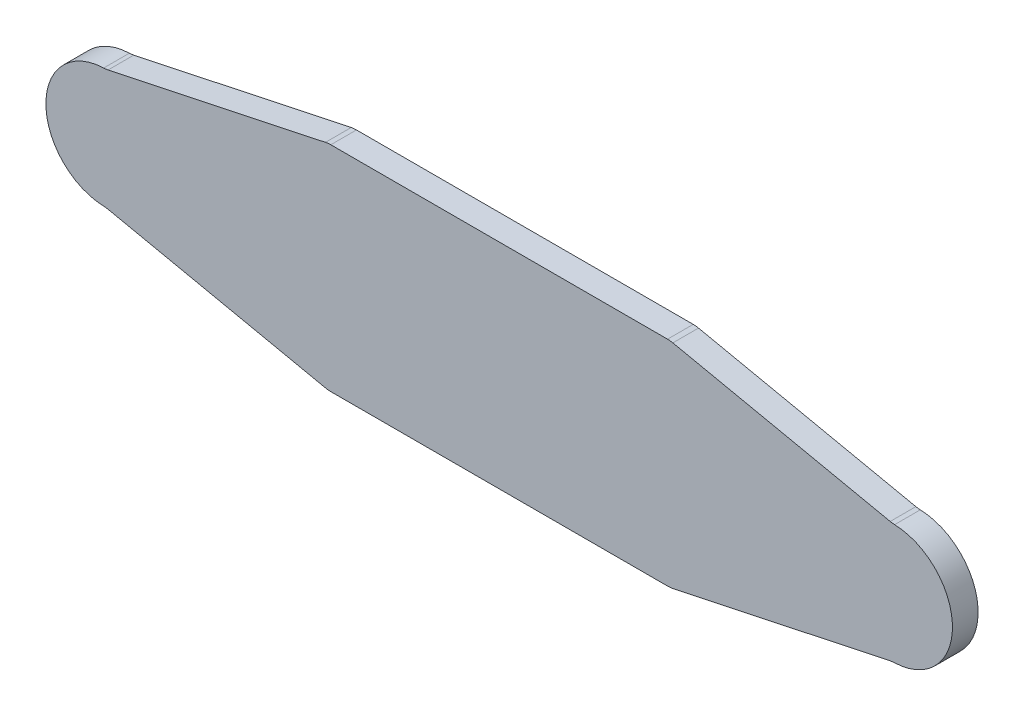
ISO-10303-21;
HEADER;
FILE_DESCRIPTION(('STEP AP214'),'2;1');
FILE_NAME('part.step','',(''),(''),'','','');
FILE_SCHEMA(('AUTOMOTIVE_DESIGN { 1 0 10303 214 1 1 1 1 }'));
ENDSEC;
DATA;
#1=APPLICATION_CONTEXT('core data for automotive mechanical design processes');
#2=APPLICATION_PROTOCOL_DEFINITION('international standard','automotive_design',2000,#1);
#3=PRODUCT_CONTEXT('',#1,'mechanical');
#4=PRODUCT('Part','Part','',(#3));
#5=PRODUCT_RELATED_PRODUCT_CATEGORY('part','',(#4));
#6=PRODUCT_DEFINITION_FORMATION('','',#4);
#7=PRODUCT_DEFINITION_CONTEXT('part definition',#1,'design');
#8=PRODUCT_DEFINITION('design','',#6,#7);
#9=PRODUCT_DEFINITION_SHAPE('','',#8);
#10=(LENGTH_UNIT() NAMED_UNIT(*) SI_UNIT(.MILLI.,.METRE.));
#11=(NAMED_UNIT(*) PLANE_ANGLE_UNIT() SI_UNIT($,.RADIAN.));
#12=(NAMED_UNIT(*) SI_UNIT($,.STERADIAN.) SOLID_ANGLE_UNIT());
#13=UNCERTAINTY_MEASURE_WITH_UNIT(LENGTH_MEASURE(1.E-05),#10,'distance_accuracy_value','');
#14=(GEOMETRIC_REPRESENTATION_CONTEXT(3) GLOBAL_UNCERTAINTY_ASSIGNED_CONTEXT((#13)) GLOBAL_UNIT_ASSIGNED_CONTEXT((#10,
#11,#12)) REPRESENTATION_CONTEXT('',''));
#15=CARTESIAN_POINT('',(0.,0.,0.));
#16=DIRECTION('',(0.,0.,1.));
#17=DIRECTION('',(1.,0.,0.));
#18=AXIS2_PLACEMENT_3D('',#15,#16,#17);
#19=CARTESIAN_POINT('',(0.,0.,3.));
#20=DIRECTION('',(0.206958591044392,-0.978349703118941,0.));
#21=DIRECTION('',(0.978349703118941,0.206958591044392,0.));
#22=AXIS2_PLACEMENT_3D('',#19,#20,#21);
#23=PLANE('',#22);
#24=DIRECTION('',(-0.978349703118941,-0.206958591044392,0.));
#25=VECTOR('',#24,1.);
#26=CARTESIAN_POINT('',(0.,0.,3.));
#27=LINE('',#26,#25);
#28=CARTESIAN_POINT('',(-0.307040573949562,-0.0649508906431766,3.));
#29=VERTEX_POINT('',#28);
#30=CARTESIAN_POINT('',(-25.7205151025413,-5.44087819476836,3.));
#31=VERTEX_POINT('',#30);
#32=EDGE_CURVE('E196',#29,#31,#27,.T.);
#33=ORIENTED_EDGE('',*,*,#32,.F.);
#34=DIRECTION('',(0.,0.,-1.));
#35=VECTOR('',#34,1.);
#36=CARTESIAN_POINT('',(-0.307040573949562,-0.0649508906431766,3.));
#37=LINE('',#36,#35);
#38=CARTESIAN_POINT('',(-0.307040573949562,-0.0649508906431766,0.));
#39=VERTEX_POINT('',#38);
#40=EDGE_CURVE('E160',#29,#39,#37,.T.);
#41=ORIENTED_EDGE('',*,*,#40,.T.);
#42=DIRECTION('',(-0.978349703118941,-0.206958591044392,0.));
#43=VECTOR('',#42,1.);
#44=CARTESIAN_POINT('',(0.,0.,0.));
#45=LINE('',#44,#43);
#46=CARTESIAN_POINT('',(-25.7205151025413,-5.44087819476836,0.));
#47=VERTEX_POINT('',#46);
#48=EDGE_CURVE('E182',#39,#47,#45,.T.);
#49=ORIENTED_EDGE('',*,*,#48,.T.);
#50=DIRECTION('',(0.,0.,1.));
#51=VECTOR('',#50,1.);
#52=CARTESIAN_POINT('',(-25.7205151025413,-5.44087819476836,3.));
#53=LINE('',#52,#51);
#54=EDGE_CURVE('E240',#47,#31,#53,.T.);
#55=ORIENTED_EDGE('',*,*,#54,.T.);
#56=EDGE_LOOP('',(#33,#41,#49,#55));
#57=FACE_BOUND('',#56,.T.);
#58=ADVANCED_FACE('F35',(#57),#23,.F.);
#59=CARTESIAN_POINT('',(-26.,-12.5,3.));
#60=DIRECTION('',(0.,0.,-1.));
#61=DIRECTION('',(-1.,0.,0.));
#62=AXIS2_PLACEMENT_3D('',#59,#60,#61);
#63=CYLINDRICAL_SURFACE('',#62,7.);
#64=CARTESIAN_POINT('',(-26.,-12.5,0.));
#65=DIRECTION('',(0.,0.,1.));
#66=DIRECTION('',(1.,0.,0.));
#67=AXIS2_PLACEMENT_3D('',#64,#65,#66);
#68=CIRCLE('',#67,7.);
#69=CARTESIAN_POINT('',(-26.2389736129721,-5.50408035978807,0.));
#70=VERTEX_POINT('',#69);
#71=CARTESIAN_POINT('',(-26.2389736129721,-19.4959196402119,0.));
#72=VERTEX_POINT('',#71);
#73=EDGE_CURVE('E177',#70,#72,#68,.T.);
#74=ORIENTED_EDGE('',*,*,#73,.T.);
#75=DIRECTION('',(0.,0.,-1.));
#76=VECTOR('',#75,1.);
#77=CARTESIAN_POINT('',(-26.2389736129721,-19.4959196402119,3.));
#78=LINE('',#77,#76);
#79=CARTESIAN_POINT('',(-26.2389736129721,-19.4959196402119,3.));
#80=VERTEX_POINT('',#79);
#81=EDGE_CURVE('E154',#72,#80,#78,.F.);
#82=ORIENTED_EDGE('',*,*,#81,.T.);
#83=CARTESIAN_POINT('',(-26.,-12.5,3.));
#84=DIRECTION('',(0.,0.,1.));
#85=DIRECTION('',(1.,0.,0.));
#86=AXIS2_PLACEMENT_3D('',#83,#84,#85);
#87=CIRCLE('',#86,7.);
#88=CARTESIAN_POINT('',(-26.2389736129721,-5.50408035978807,3.));
#89=VERTEX_POINT('',#88);
#90=EDGE_CURVE('E265',#89,#80,#87,.T.);
#91=ORIENTED_EDGE('',*,*,#90,.F.);
#92=DIRECTION('',(0.,0.,-1.));
#93=VECTOR('',#92,1.);
#94=CARTESIAN_POINT('',(-26.2389736129721,-5.50408035978807,3.));
#95=LINE('',#94,#93);
#96=EDGE_CURVE('E170',#89,#70,#95,.T.);
#97=ORIENTED_EDGE('',*,*,#96,.T.);
#98=EDGE_LOOP('',(#74,#82,#91,#97));
#99=FACE_BOUND('',#98,.T.);
#100=ADVANCED_FACE('F267',(#99),#63,.T.);
#101=CARTESIAN_POINT('',(0.,-25.,3.));
#102=DIRECTION('',(0.206958591044391,0.978349703118941,0.));
#103=DIRECTION('',(-0.978349703118941,0.206958591044391,0.));
#104=AXIS2_PLACEMENT_3D('',#101,#102,#103);
#105=PLANE('',#104);
#106=DIRECTION('',(0.978349703118941,-0.206958591044391,0.));
#107=VECTOR('',#106,1.);
#108=CARTESIAN_POINT('',(0.,-25.,3.));
#109=LINE('',#108,#107);
#110=CARTESIAN_POINT('',(-25.7205151025413,-19.5591218052317,3.));
#111=VERTEX_POINT('',#110);
#112=CARTESIAN_POINT('',(-0.307040573949554,-24.9350491093568,3.));
#113=VERTEX_POINT('',#112);
#114=EDGE_CURVE('E169',#111,#113,#109,.T.);
#115=ORIENTED_EDGE('',*,*,#114,.F.);
#116=DIRECTION('',(0.,0.,1.));
#117=VECTOR('',#116,1.);
#118=CARTESIAN_POINT('',(-25.7205151025413,-19.5591218052317,0.));
#119=LINE('',#118,#117);
#120=CARTESIAN_POINT('',(-25.7205151025413,-19.5591218052317,0.));
#121=VERTEX_POINT('',#120);
#122=EDGE_CURVE('E153',#111,#121,#119,.F.);
#123=ORIENTED_EDGE('',*,*,#122,.T.);
#124=DIRECTION('',(0.978349703118941,-0.206958591044391,0.));
#125=VECTOR('',#124,1.);
#126=CARTESIAN_POINT('',(0.,-25.,0.));
#127=LINE('',#126,#125);
#128=CARTESIAN_POINT('',(-0.307040573949554,-24.9350491093568,0.));
#129=VERTEX_POINT('',#128);
#130=EDGE_CURVE('E166',#121,#129,#127,.T.);
#131=ORIENTED_EDGE('',*,*,#130,.T.);
#132=DIRECTION('',(0.,0.,-1.));
#133=VECTOR('',#132,1.);
#134=CARTESIAN_POINT('',(-0.307040573949554,-24.9350491093568,3.));
#135=LINE('',#134,#133);
#136=EDGE_CURVE('E171',#129,#113,#135,.F.);
#137=ORIENTED_EDGE('',*,*,#136,.T.);
#138=EDGE_LOOP('',(#115,#123,#131,#137));
#139=FACE_BOUND('',#138,.T.);
#140=ADVANCED_FACE('F165',(#139),#105,.F.);
#141=CARTESIAN_POINT('',(0.,-25.,3.));
#142=DIRECTION('',(0.,1.,0.));
#143=DIRECTION('',(0.,0.,1.));
#144=AXIS2_PLACEMENT_3D('',#141,#142,#143);
#145=PLANE('',#144);
#146=DIRECTION('',(1.,0.,0.));
#147=VECTOR('',#146,1.);
#148=CARTESIAN_POINT('',(0.,-25.,3.));
#149=LINE('',#148,#147);
#150=CARTESIAN_POINT('',(0.31383519918362,-25.,3.));
#151=VERTEX_POINT('',#150);
#152=CARTESIAN_POINT('',(39.6861648008164,-25.,3.));
#153=VERTEX_POINT('',#152);
#154=EDGE_CURVE('E269',#151,#153,#149,.T.);
#155=ORIENTED_EDGE('',*,*,#154,.F.);
#156=DIRECTION('',(0.,0.,-1.));
#157=VECTOR('',#156,1.);
#158=CARTESIAN_POINT('',(0.31383519918362,-25.,3.));
#159=LINE('',#158,#157);
#160=CARTESIAN_POINT('',(0.31383519918362,-25.,0.));
#161=VERTEX_POINT('',#160);
#162=EDGE_CURVE('E204',#151,#161,#159,.T.);
#163=ORIENTED_EDGE('',*,*,#162,.T.);
#164=DIRECTION('',(1.,0.,0.));
#165=VECTOR('',#164,1.);
#166=CARTESIAN_POINT('',(0.,-25.,0.));
#167=LINE('',#166,#165);
#168=CARTESIAN_POINT('',(39.6861648008164,-25.,0.));
#169=VERTEX_POINT('',#168);
#170=EDGE_CURVE('E176',#161,#169,#167,.T.);
#171=ORIENTED_EDGE('',*,*,#170,.T.);
#172=DIRECTION('',(0.,0.,-1.));
#173=VECTOR('',#172,1.);
#174=CARTESIAN_POINT('',(39.6861648008164,-25.,3.));
#175=LINE('',#174,#173);
#176=EDGE_CURVE('E202',#169,#153,#175,.F.);
#177=ORIENTED_EDGE('',*,*,#176,.T.);
#178=EDGE_LOOP('',(#155,#163,#171,#177));
#179=FACE_BOUND('',#178,.T.);
#180=ADVANCED_FACE('F321',(#179),#145,.F.);
#181=CARTESIAN_POINT('',(40.,-25.,3.));
#182=DIRECTION('',(-0.206958591044391,0.978349703118941,0.));
#183=DIRECTION('',(-0.978349703118941,-0.206958591044391,0.));
#184=AXIS2_PLACEMENT_3D('',#181,#182,#183);
#185=PLANE('',#184);
#186=DIRECTION('',(0.978349703118941,0.206958591044391,0.));
#187=VECTOR('',#186,1.);
#188=CARTESIAN_POINT('',(40.,-25.,3.));
#189=LINE('',#188,#187);
#190=CARTESIAN_POINT('',(40.3070405739496,-24.9350491093568,3.));
#191=VERTEX_POINT('',#190);
#192=CARTESIAN_POINT('',(65.7205151025413,-19.5591218052317,3.));
#193=VERTEX_POINT('',#192);
#194=EDGE_CURVE('E275',#191,#193,#189,.T.);
#195=ORIENTED_EDGE('',*,*,#194,.F.);
#196=DIRECTION('',(0.,0.,-1.));
#197=VECTOR('',#196,1.);
#198=CARTESIAN_POINT('',(40.3070405739496,-24.9350491093568,3.));
#199=LINE('',#198,#197);
#200=CARTESIAN_POINT('',(40.3070405739496,-24.9350491093568,0.));
#201=VERTEX_POINT('',#200);
#202=EDGE_CURVE('E223',#191,#201,#199,.T.);
#203=ORIENTED_EDGE('',*,*,#202,.T.);
#204=DIRECTION('',(0.978349703118941,0.206958591044391,0.));
#205=VECTOR('',#204,1.);
#206=CARTESIAN_POINT('',(40.,-25.,0.));
#207=LINE('',#206,#205);
#208=CARTESIAN_POINT('',(65.7205151025413,-19.5591218052317,0.));
#209=VERTEX_POINT('',#208);
#210=EDGE_CURVE('E180',#201,#209,#207,.T.);
#211=ORIENTED_EDGE('',*,*,#210,.T.);
#212=DIRECTION('',(0.,0.,1.));
#213=VECTOR('',#212,1.);
#214=CARTESIAN_POINT('',(65.7205151025413,-19.5591218052317,3.));
#215=LINE('',#214,#213);
#216=EDGE_CURVE('E221',#209,#193,#215,.T.);
#217=ORIENTED_EDGE('',*,*,#216,.T.);
#218=EDGE_LOOP('',(#195,#203,#211,#217));
#219=FACE_BOUND('',#218,.T.);
#220=ADVANCED_FACE('F313',(#219),#185,.F.);
#221=CARTESIAN_POINT('',(66.,-12.5,3.));
#222=DIRECTION('',(0.,0.,-1.));
#223=DIRECTION('',(-1.,0.,0.));
#224=AXIS2_PLACEMENT_3D('',#221,#222,#223);
#225=CYLINDRICAL_SURFACE('',#224,7.);
#226=CARTESIAN_POINT('',(66.,-12.5,3.));
#227=DIRECTION('',(0.,0.,1.));
#228=DIRECTION('',(-1.,0.,0.));
#229=AXIS2_PLACEMENT_3D('',#226,#227,#228);
#230=CIRCLE('',#229,7.);
#231=CARTESIAN_POINT('',(66.2389736129721,-19.495919640212,3.));
#232=VERTEX_POINT('',#231);
#233=CARTESIAN_POINT('',(66.2389736129721,-5.50408035978809,3.));
#234=VERTEX_POINT('',#233);
#235=EDGE_CURVE('E278',#232,#234,#230,.T.);
#236=ORIENTED_EDGE('',*,*,#235,.F.);
#237=DIRECTION('',(0.,0.,-1.));
#238=VECTOR('',#237,1.);
#239=CARTESIAN_POINT('',(66.2389736129721,-19.495919640212,3.));
#240=LINE('',#239,#238);
#241=CARTESIAN_POINT('',(66.2389736129721,-19.495919640212,0.));
#242=VERTEX_POINT('',#241);
#243=EDGE_CURVE('E228',#232,#242,#240,.T.);
#244=ORIENTED_EDGE('',*,*,#243,.T.);
#245=CARTESIAN_POINT('',(66.,-12.5,0.));
#246=DIRECTION('',(0.,0.,1.));
#247=DIRECTION('',(-1.,0.,0.));
#248=AXIS2_PLACEMENT_3D('',#245,#246,#247);
#249=CIRCLE('',#248,7.);
#250=CARTESIAN_POINT('',(66.2389736129721,-5.50408035978809,0.));
#251=VERTEX_POINT('',#250);
#252=EDGE_CURVE('E188',#242,#251,#249,.T.);
#253=ORIENTED_EDGE('',*,*,#252,.T.);
#254=DIRECTION('',(0.,0.,-1.));
#255=VECTOR('',#254,1.);
#256=CARTESIAN_POINT('',(66.2389736129721,-5.50408035978808,3.));
#257=LINE('',#256,#255);
#258=EDGE_CURVE('E226',#251,#234,#257,.F.);
#259=ORIENTED_EDGE('',*,*,#258,.T.);
#260=EDGE_LOOP('',(#236,#244,#253,#259));
#261=FACE_BOUND('',#260,.T.);
#262=ADVANCED_FACE('F304',(#261),#225,.T.);
#263=CARTESIAN_POINT('',(40.,0.,3.));
#264=DIRECTION('',(-0.206958591044392,-0.978349703118941,0.));
#265=DIRECTION('',(0.978349703118941,-0.206958591044392,0.));
#266=AXIS2_PLACEMENT_3D('',#263,#264,#265);
#267=PLANE('',#266);
#268=DIRECTION('',(-0.978349703118941,0.206958591044392,0.));
#269=VECTOR('',#268,1.);
#270=CARTESIAN_POINT('',(40.,0.,3.));
#271=LINE('',#270,#269);
#272=CARTESIAN_POINT('',(65.7205151025413,-5.44087819476837,3.));
#273=VERTEX_POINT('',#272);
#274=CARTESIAN_POINT('',(40.3070405739496,-0.064950890643177,3.));
#275=VERTEX_POINT('',#274);
#276=EDGE_CURVE('E281',#273,#275,#271,.T.);
#277=ORIENTED_EDGE('',*,*,#276,.F.);
#278=DIRECTION('',(0.,0.,1.));
#279=VECTOR('',#278,1.);
#280=CARTESIAN_POINT('',(65.7205151025413,-5.44087819476837,0.));
#281=LINE('',#280,#279);
#282=CARTESIAN_POINT('',(65.7205151025413,-5.44087819476837,0.));
#283=VERTEX_POINT('',#282);
#284=EDGE_CURVE('E233',#273,#283,#281,.F.);
#285=ORIENTED_EDGE('',*,*,#284,.T.);
#286=DIRECTION('',(-0.978349703118941,0.206958591044392,0.));
#287=VECTOR('',#286,1.);
#288=CARTESIAN_POINT('',(40.,0.,0.));
#289=LINE('',#288,#287);
#290=CARTESIAN_POINT('',(40.3070405739496,-0.064950890643177,0.));
#291=VERTEX_POINT('',#290);
#292=EDGE_CURVE('E191',#283,#291,#289,.T.);
#293=ORIENTED_EDGE('',*,*,#292,.T.);
#294=DIRECTION('',(0.,0.,-1.));
#295=VECTOR('',#294,1.);
#296=CARTESIAN_POINT('',(40.3070405739496,-0.064950890643177,3.));
#297=LINE('',#296,#295);
#298=EDGE_CURVE('E231',#291,#275,#297,.F.);
#299=ORIENTED_EDGE('',*,*,#298,.T.);
#300=EDGE_LOOP('',(#277,#285,#293,#299));
#301=FACE_BOUND('',#300,.T.);
#302=ADVANCED_FACE('F295',(#301),#267,.F.);
#303=CARTESIAN_POINT('',(0.,0.,3.));
#304=DIRECTION('',(0.,-1.,0.));
#305=DIRECTION('',(0.,0.,-1.));
#306=AXIS2_PLACEMENT_3D('',#303,#304,#305);
#307=PLANE('',#306);
#308=DIRECTION('',(-1.,0.,0.));
#309=VECTOR('',#308,1.);
#310=CARTESIAN_POINT('',(0.,0.,3.));
#311=LINE('',#310,#309);
#312=CARTESIAN_POINT('',(39.6861648008164,0.,3.));
#313=VERTEX_POINT('',#312);
#314=CARTESIAN_POINT('',(0.313835199183613,0.,3.));
#315=VERTEX_POINT('',#314);
#316=EDGE_CURVE('E197',#313,#315,#311,.T.);
#317=ORIENTED_EDGE('',*,*,#316,.F.);
#318=DIRECTION('',(0.,0.,-1.));
#319=VECTOR('',#318,1.);
#320=CARTESIAN_POINT('',(39.6861648008164,0.,3.));
#321=LINE('',#320,#319);
#322=CARTESIAN_POINT('',(39.6861648008164,0.,0.));
#323=VERTEX_POINT('',#322);
#324=EDGE_CURVE('E237',#313,#323,#321,.T.);
#325=ORIENTED_EDGE('',*,*,#324,.T.);
#326=DIRECTION('',(-1.,0.,0.));
#327=VECTOR('',#326,1.);
#328=CARTESIAN_POINT('',(0.,0.,0.));
#329=LINE('',#328,#327);
#330=CARTESIAN_POINT('',(0.313835199183613,0.,0.));
#331=VERTEX_POINT('',#330);
#332=EDGE_CURVE('E194',#323,#331,#329,.T.);
#333=ORIENTED_EDGE('',*,*,#332,.T.);
#334=DIRECTION('',(0.,0.,-1.));
#335=VECTOR('',#334,1.);
#336=CARTESIAN_POINT('',(0.313835199183613,0.,3.));
#337=LINE('',#336,#335);
#338=EDGE_CURVE('E50',#331,#315,#337,.F.);
#339=ORIENTED_EDGE('',*,*,#338,.T.);
#340=EDGE_LOOP('',(#317,#325,#333,#339));
#341=FACE_BOUND('',#340,.T.);
#342=ADVANCED_FACE('F288',(#341),#307,.F.);
#343=CARTESIAN_POINT('',(-26.,-12.5,3.));
#344=DIRECTION('',(0.,0.,1.));
#345=DIRECTION('',(1.,0.,0.));
#346=AXIS2_PLACEMENT_3D('',#343,#344,#345);
#347=PLANE('',#346);
#348=ORIENTED_EDGE('',*,*,#114,.T.);
#349=CARTESIAN_POINT('',(0.31383519918362,-22.,3.));
#350=DIRECTION('',(0.,0.,1.));
#351=DIRECTION('',(1.,0.,0.));
#352=AXIS2_PLACEMENT_3D('',#349,#350,#351);
#353=CIRCLE('',#352,3.);
#354=EDGE_CURVE('E219',#113,#151,#353,.T.);
#355=ORIENTED_EDGE('',*,*,#354,.T.);
#356=ORIENTED_EDGE('',*,*,#154,.T.);
#357=CARTESIAN_POINT('',(39.6861648008164,-22.,3.));
#358=DIRECTION('',(0.,0.,1.));
#359=DIRECTION('',(1.,0.,0.));
#360=AXIS2_PLACEMENT_3D('',#357,#358,#359);
#361=CIRCLE('',#360,3.);
#362=EDGE_CURVE('E217',#153,#191,#361,.T.);
#363=ORIENTED_EDGE('',*,*,#362,.T.);
#364=ORIENTED_EDGE('',*,*,#194,.T.);
#365=CARTESIAN_POINT('',(66.3413908756744,-22.4941709145885,3.));
#366=DIRECTION('',(0.,0.,1.));
#367=DIRECTION('',(1.,0.,0.));
#368=AXIS2_PLACEMENT_3D('',#365,#366,#367);
#369=CIRCLE('',#368,3.);
#370=EDGE_CURVE('E247',#193,#232,#369,.F.);
#371=ORIENTED_EDGE('',*,*,#370,.T.);
#372=ORIENTED_EDGE('',*,*,#235,.T.);
#373=CARTESIAN_POINT('',(66.3413908756745,-2.50582908541154,3.));
#374=DIRECTION('',(0.,0.,1.));
#375=DIRECTION('',(1.,0.,0.));
#376=AXIS2_PLACEMENT_3D('',#373,#374,#375);
#377=CIRCLE('',#376,3.);
#378=EDGE_CURVE('E251',#234,#273,#377,.F.);
#379=ORIENTED_EDGE('',*,*,#378,.T.);
#380=ORIENTED_EDGE('',*,*,#276,.T.);
#381=CARTESIAN_POINT('',(39.6861648008164,-3.,3.));
#382=DIRECTION('',(0.,0.,1.));
#383=DIRECTION('',(1.,0.,0.));
#384=AXIS2_PLACEMENT_3D('',#381,#382,#383);
#385=CIRCLE('',#384,3.);
#386=EDGE_CURVE('E57',#275,#313,#385,.T.);
#387=ORIENTED_EDGE('',*,*,#386,.T.);
#388=ORIENTED_EDGE('',*,*,#316,.T.);
#389=CARTESIAN_POINT('',(0.313835199183613,-3.,3.));
#390=DIRECTION('',(0.,0.,1.));
#391=DIRECTION('',(1.,0.,0.));
#392=AXIS2_PLACEMENT_3D('',#389,#390,#391);
#393=CIRCLE('',#392,3.);
#394=EDGE_CURVE('E214',#315,#29,#393,.T.);
#395=ORIENTED_EDGE('',*,*,#394,.T.);
#396=ORIENTED_EDGE('',*,*,#32,.T.);
#397=CARTESIAN_POINT('',(-26.3413908756745,-2.50582908541153,3.));
#398=DIRECTION('',(0.,0.,1.));
#399=DIRECTION('',(1.,0.,0.));
#400=AXIS2_PLACEMENT_3D('',#397,#398,#399);
#401=CIRCLE('',#400,3.);
#402=EDGE_CURVE('E11',#31,#89,#401,.F.);
#403=ORIENTED_EDGE('',*,*,#402,.T.);
#404=ORIENTED_EDGE('',*,*,#90,.T.);
#405=CARTESIAN_POINT('',(-26.3413908756745,-22.4941709145885,3.));
#406=DIRECTION('',(0.,0.,1.));
#407=DIRECTION('',(1.,0.,0.));
#408=AXIS2_PLACEMENT_3D('',#405,#406,#407);
#409=CIRCLE('',#408,3.);
#410=EDGE_CURVE('E159',#80,#111,#409,.F.);
#411=ORIENTED_EDGE('',*,*,#410,.T.);
#412=EDGE_LOOP('',(#348,#355,#356,#363,#364,#371,#372,#379,#380,#387,#388,#395,#396,#403,#404,#411));
#413=FACE_BOUND('',#412,.T.);
#414=ADVANCED_FACE('F264',(#413),#347,.T.);
#415=CARTESIAN_POINT('',(-26.,-12.5,0.));
#416=DIRECTION('',(0.,0.,1.));
#417=DIRECTION('',(1.,0.,0.));
#418=AXIS2_PLACEMENT_3D('',#415,#416,#417);
#419=PLANE('',#418);
#420=ORIENTED_EDGE('',*,*,#170,.F.);
#421=CARTESIAN_POINT('',(0.31383519918362,-22.,0.));
#422=DIRECTION('',(0.,0.,1.));
#423=DIRECTION('',(1.,0.,0.));
#424=AXIS2_PLACEMENT_3D('',#421,#422,#423);
#425=CIRCLE('',#424,3.);
#426=EDGE_CURVE('E175',#161,#129,#425,.F.);
#427=ORIENTED_EDGE('',*,*,#426,.T.);
#428=ORIENTED_EDGE('',*,*,#130,.F.);
#429=CARTESIAN_POINT('',(-26.3413908756745,-22.4941709145885,0.));
#430=DIRECTION('',(0.,0.,1.));
#431=DIRECTION('',(1.,0.,0.));
#432=AXIS2_PLACEMENT_3D('',#429,#430,#431);
#433=CIRCLE('',#432,3.);
#434=EDGE_CURVE('E149',#121,#72,#433,.T.);
#435=ORIENTED_EDGE('',*,*,#434,.T.);
#436=ORIENTED_EDGE('',*,*,#73,.F.);
#437=CARTESIAN_POINT('',(-26.3413908756745,-2.50582908541153,0.));
#438=DIRECTION('',(0.,0.,1.));
#439=DIRECTION('',(1.,0.,0.));
#440=AXIS2_PLACEMENT_3D('',#437,#438,#439);
#441=CIRCLE('',#440,3.);
#442=EDGE_CURVE('E43',#70,#47,#441,.T.);
#443=ORIENTED_EDGE('',*,*,#442,.T.);
#444=ORIENTED_EDGE('',*,*,#48,.F.);
#445=CARTESIAN_POINT('',(0.313835199183613,-3.,0.));
#446=DIRECTION('',(0.,0.,1.));
#447=DIRECTION('',(1.,0.,0.));
#448=AXIS2_PLACEMENT_3D('',#445,#446,#447);
#449=CIRCLE('',#448,3.);
#450=EDGE_CURVE('E207',#39,#331,#449,.F.);
#451=ORIENTED_EDGE('',*,*,#450,.T.);
#452=ORIENTED_EDGE('',*,*,#332,.F.);
#453=CARTESIAN_POINT('',(39.6861648008164,-3.,0.));
#454=DIRECTION('',(0.,0.,1.));
#455=DIRECTION('',(1.,0.,0.));
#456=AXIS2_PLACEMENT_3D('',#453,#454,#455);
#457=CIRCLE('',#456,3.);
#458=EDGE_CURVE('E209',#323,#291,#457,.F.);
#459=ORIENTED_EDGE('',*,*,#458,.T.);
#460=ORIENTED_EDGE('',*,*,#292,.F.);
#461=CARTESIAN_POINT('',(66.3413908756745,-2.50582908541154,0.));
#462=DIRECTION('',(0.,0.,1.));
#463=DIRECTION('',(1.,0.,0.));
#464=AXIS2_PLACEMENT_3D('',#461,#462,#463);
#465=CIRCLE('',#464,3.);
#466=EDGE_CURVE('E249',#283,#251,#465,.T.);
#467=ORIENTED_EDGE('',*,*,#466,.T.);
#468=ORIENTED_EDGE('',*,*,#252,.F.);
#469=CARTESIAN_POINT('',(66.3413908756744,-22.4941709145885,0.));
#470=DIRECTION('',(0.,0.,1.));
#471=DIRECTION('',(1.,0.,0.));
#472=AXIS2_PLACEMENT_3D('',#469,#470,#471);
#473=CIRCLE('',#472,3.);
#474=EDGE_CURVE('E245',#242,#209,#473,.T.);
#475=ORIENTED_EDGE('',*,*,#474,.T.);
#476=ORIENTED_EDGE('',*,*,#210,.F.);
#477=CARTESIAN_POINT('',(39.6861648008164,-22.,0.));
#478=DIRECTION('',(0.,0.,1.));
#479=DIRECTION('',(1.,0.,0.));
#480=AXIS2_PLACEMENT_3D('',#477,#478,#479);
#481=CIRCLE('',#480,3.);
#482=EDGE_CURVE('E211',#201,#169,#481,.F.);
#483=ORIENTED_EDGE('',*,*,#482,.T.);
#484=EDGE_LOOP('',(#420,#427,#428,#435,#436,#443,#444,#451,#452,#459,#460,#467,#468,#475,#476,#483));
#485=FACE_BOUND('',#484,.T.);
#486=ADVANCED_FACE('F174',(#485),#419,.F.);
#487=CARTESIAN_POINT('',(-26.3413908756745,-22.4941709145885,3.));
#488=DIRECTION('',(0.,0.,-1.));
#489=DIRECTION('',(-1.,0.,0.));
#490=AXIS2_PLACEMENT_3D('',#487,#488,#489);
#491=CYLINDRICAL_SURFACE('',#490,3.);
#492=ORIENTED_EDGE('',*,*,#410,.F.);
#493=ORIENTED_EDGE('',*,*,#81,.F.);
#494=ORIENTED_EDGE('',*,*,#434,.F.);
#495=ORIENTED_EDGE('',*,*,#122,.F.);
#496=EDGE_LOOP('',(#492,#493,#494,#495));
#497=FACE_BOUND('',#496,.T.);
#498=ADVANCED_FACE('F152',(#497),#491,.F.);
#499=CARTESIAN_POINT('',(0.31383519918362,-22.,3.));
#500=DIRECTION('',(0.,0.,-1.));
#501=DIRECTION('',(-1.,0.,0.));
#502=AXIS2_PLACEMENT_3D('',#499,#500,#501);
#503=CYLINDRICAL_SURFACE('',#502,3.);
#504=ORIENTED_EDGE('',*,*,#354,.F.);
#505=ORIENTED_EDGE('',*,*,#136,.F.);
#506=ORIENTED_EDGE('',*,*,#426,.F.);
#507=ORIENTED_EDGE('',*,*,#162,.F.);
#508=EDGE_LOOP('',(#504,#505,#506,#507));
#509=FACE_BOUND('',#508,.T.);
#510=ADVANCED_FACE('F325',(#509),#503,.T.);
#511=CARTESIAN_POINT('',(39.6861648008164,-22.,3.));
#512=DIRECTION('',(0.,0.,-1.));
#513=DIRECTION('',(-1.,0.,0.));
#514=AXIS2_PLACEMENT_3D('',#511,#512,#513);
#515=CYLINDRICAL_SURFACE('',#514,3.);
#516=ORIENTED_EDGE('',*,*,#362,.F.);
#517=ORIENTED_EDGE('',*,*,#176,.F.);
#518=ORIENTED_EDGE('',*,*,#482,.F.);
#519=ORIENTED_EDGE('',*,*,#202,.F.);
#520=EDGE_LOOP('',(#516,#517,#518,#519));
#521=FACE_BOUND('',#520,.T.);
#522=ADVANCED_FACE('F317',(#521),#515,.T.);
#523=CARTESIAN_POINT('',(66.3413908756744,-22.4941709145885,3.));
#524=DIRECTION('',(0.,0.,-1.));
#525=DIRECTION('',(-1.,0.,0.));
#526=AXIS2_PLACEMENT_3D('',#523,#524,#525);
#527=CYLINDRICAL_SURFACE('',#526,3.);
#528=ORIENTED_EDGE('',*,*,#370,.F.);
#529=ORIENTED_EDGE('',*,*,#216,.F.);
#530=ORIENTED_EDGE('',*,*,#474,.F.);
#531=ORIENTED_EDGE('',*,*,#243,.F.);
#532=EDGE_LOOP('',(#528,#529,#530,#531));
#533=FACE_BOUND('',#532,.T.);
#534=ADVANCED_FACE('F308',(#533),#527,.F.);
#535=CARTESIAN_POINT('',(66.3413908756745,-2.50582908541154,3.));
#536=DIRECTION('',(0.,0.,-1.));
#537=DIRECTION('',(-1.,0.,0.));
#538=AXIS2_PLACEMENT_3D('',#535,#536,#537);
#539=CYLINDRICAL_SURFACE('',#538,3.);
#540=ORIENTED_EDGE('',*,*,#378,.F.);
#541=ORIENTED_EDGE('',*,*,#258,.F.);
#542=ORIENTED_EDGE('',*,*,#466,.F.);
#543=ORIENTED_EDGE('',*,*,#284,.F.);
#544=EDGE_LOOP('',(#540,#541,#542,#543));
#545=FACE_BOUND('',#544,.T.);
#546=ADVANCED_FACE('F299',(#545),#539,.F.);
#547=CARTESIAN_POINT('',(39.6861648008164,-3.,3.));
#548=DIRECTION('',(0.,0.,-1.));
#549=DIRECTION('',(-1.,0.,0.));
#550=AXIS2_PLACEMENT_3D('',#547,#548,#549);
#551=CYLINDRICAL_SURFACE('',#550,3.);
#552=ORIENTED_EDGE('',*,*,#386,.F.);
#553=ORIENTED_EDGE('',*,*,#298,.F.);
#554=ORIENTED_EDGE('',*,*,#458,.F.);
#555=ORIENTED_EDGE('',*,*,#324,.F.);
#556=EDGE_LOOP('',(#552,#553,#554,#555));
#557=FACE_BOUND('',#556,.T.);
#558=ADVANCED_FACE('F290',(#557),#551,.T.);
#559=CARTESIAN_POINT('',(0.313835199183613,-3.,3.));
#560=DIRECTION('',(0.,0.,-1.));
#561=DIRECTION('',(-1.,0.,0.));
#562=AXIS2_PLACEMENT_3D('',#559,#560,#561);
#563=CYLINDRICAL_SURFACE('',#562,3.);
#564=ORIENTED_EDGE('',*,*,#394,.F.);
#565=ORIENTED_EDGE('',*,*,#338,.F.);
#566=ORIENTED_EDGE('',*,*,#450,.F.);
#567=ORIENTED_EDGE('',*,*,#40,.F.);
#568=EDGE_LOOP('',(#564,#565,#566,#567));
#569=FACE_BOUND('',#568,.T.);
#570=ADVANCED_FACE('F286',(#569),#563,.T.);
#571=CARTESIAN_POINT('',(-26.3413908756745,-2.50582908541153,3.));
#572=DIRECTION('',(0.,0.,-1.));
#573=DIRECTION('',(-1.,0.,0.));
#574=AXIS2_PLACEMENT_3D('',#571,#572,#573);
#575=CYLINDRICAL_SURFACE('',#574,3.);
#576=ORIENTED_EDGE('',*,*,#402,.F.);
#577=ORIENTED_EDGE('',*,*,#54,.F.);
#578=ORIENTED_EDGE('',*,*,#442,.F.);
#579=ORIENTED_EDGE('',*,*,#96,.F.);
#580=EDGE_LOOP('',(#576,#577,#578,#579));
#581=FACE_BOUND('',#580,.T.);
#582=ADVANCED_FACE('F37',(#581),#575,.F.);
#583=CLOSED_SHELL('',(#58,#100,#140,#180,#220,#262,#302,#342,#414,#486,#498,#510,#522,#534,#546,
#558,#570,#582));
#584=MANIFOLD_SOLID_BREP('B2',#583);
#585=ADVANCED_BREP_SHAPE_REPRESENTATION('',(#18,#584),#14);
#586=SHAPE_DEFINITION_REPRESENTATION(#9,#585);
ENDSEC;
END-ISO-10303-21;
